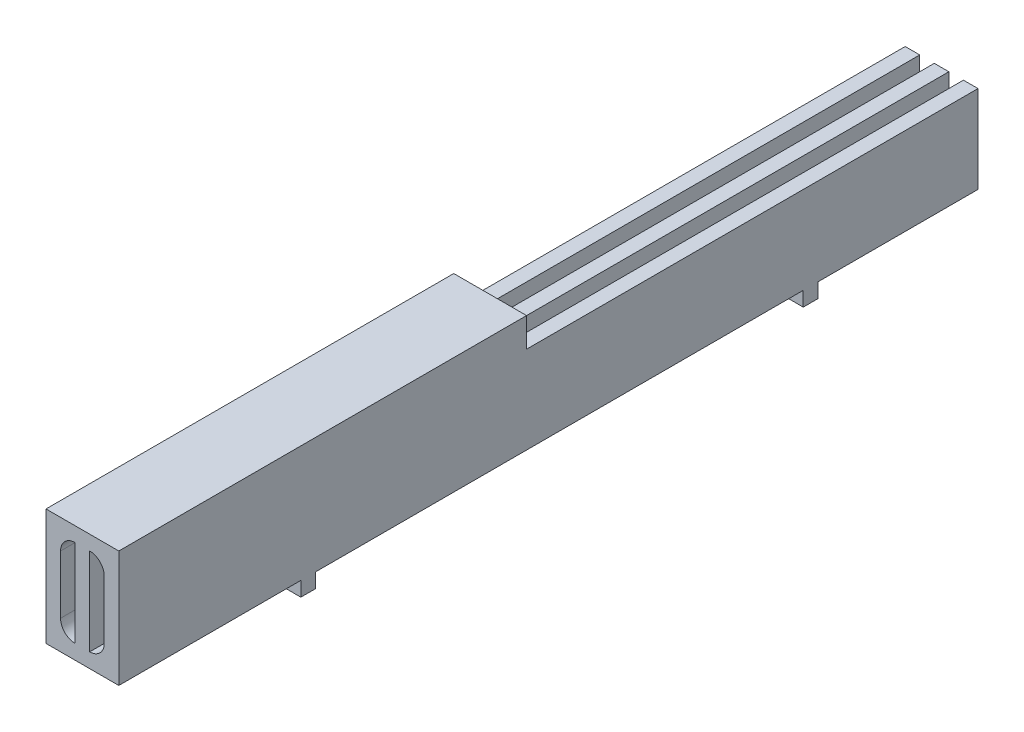
ISO-10303-21;
HEADER;
FILE_DESCRIPTION(('STEP AP214'),'2;1');
FILE_NAME('part.step','',(''),(''),'','','');
FILE_SCHEMA(('AUTOMOTIVE_DESIGN { 1 0 10303 214 1 1 1 1 }'));
ENDSEC;
DATA;
#1=APPLICATION_CONTEXT('core data for automotive mechanical design processes');
#2=APPLICATION_PROTOCOL_DEFINITION('international standard','automotive_design',2000,#1);
#3=PRODUCT_CONTEXT('',#1,'mechanical');
#4=PRODUCT('Part','Part','',(#3));
#5=PRODUCT_RELATED_PRODUCT_CATEGORY('part','',(#4));
#6=PRODUCT_DEFINITION_FORMATION('','',#4);
#7=PRODUCT_DEFINITION_CONTEXT('part definition',#1,'design');
#8=PRODUCT_DEFINITION('design','',#6,#7);
#9=PRODUCT_DEFINITION_SHAPE('','',#8);
#10=(LENGTH_UNIT() NAMED_UNIT(*) SI_UNIT(.MILLI.,.METRE.));
#11=(NAMED_UNIT(*) PLANE_ANGLE_UNIT() SI_UNIT($,.RADIAN.));
#12=(NAMED_UNIT(*) SI_UNIT($,.STERADIAN.) SOLID_ANGLE_UNIT());
#13=UNCERTAINTY_MEASURE_WITH_UNIT(LENGTH_MEASURE(1.E-05),#10,'distance_accuracy_value','');
#14=(GEOMETRIC_REPRESENTATION_CONTEXT(3) GLOBAL_UNCERTAINTY_ASSIGNED_CONTEXT((#13)) GLOBAL_UNIT_ASSIGNED_CONTEXT((#10,
#11,#12)) REPRESENTATION_CONTEXT('',''));
#15=CARTESIAN_POINT('',(0.,0.,0.));
#16=DIRECTION('',(0.,0.,1.));
#17=DIRECTION('',(1.,0.,0.));
#18=AXIS2_PLACEMENT_3D('',#15,#16,#17);
#19=CARTESIAN_POINT('',(0.,-4.,59.));
#20=DIRECTION('',(0.,1.,0.));
#21=DIRECTION('',(0.,0.,1.));
#22=AXIS2_PLACEMENT_3D('',#19,#20,#21);
#23=PLANE('',#22);
#24=DIRECTION('',(1.,0.,0.));
#25=VECTOR('',#24,1.);
#26=CARTESIAN_POINT('',(-2.5,-4.,45.5));
#27=LINE('',#26,#25);
#28=CARTESIAN_POINT('',(-2.5,-4.,45.5));
#29=VERTEX_POINT('',#28);
#30=CARTESIAN_POINT('',(2.5,-4.,45.5));
#31=VERTEX_POINT('',#30);
#32=EDGE_CURVE('E277',#29,#31,#27,.T.);
#33=ORIENTED_EDGE('',*,*,#32,.F.);
#34=DIRECTION('',(0.,0.,-1.));
#35=VECTOR('',#34,1.);
#36=CARTESIAN_POINT('',(-2.5,-4.,59.));
#37=LINE('',#36,#35);
#38=CARTESIAN_POINT('',(-2.5,-4.,12.));
#39=VERTEX_POINT('',#38);
#40=EDGE_CURVE('E435',#29,#39,#37,.T.);
#41=ORIENTED_EDGE('',*,*,#40,.T.);
#42=DIRECTION('',(-1.,0.,0.));
#43=VECTOR('',#42,1.);
#44=CARTESIAN_POINT('',(2.5,-4.,12.));
#45=LINE('',#44,#43);
#46=CARTESIAN_POINT('',(2.5,-4.,12.));
#47=VERTEX_POINT('',#46);
#48=EDGE_CURVE('E313',#47,#39,#45,.T.);
#49=ORIENTED_EDGE('',*,*,#48,.F.);
#50=DIRECTION('',(0.,0.,-1.));
#51=VECTOR('',#50,1.);
#52=CARTESIAN_POINT('',(2.5,-4.,59.));
#53=LINE('',#52,#51);
#54=EDGE_CURVE('E73',#31,#47,#53,.T.);
#55=ORIENTED_EDGE('',*,*,#54,.F.);
#56=EDGE_LOOP('',(#33,#41,#49,#55));
#57=FACE_BOUND('',#56,.T.);
#58=ADVANCED_FACE('F49',(#57),#23,.F.);
#59=DIRECTION('',(-1.,0.,0.));
#60=VECTOR('',#59,1.);
#61=CARTESIAN_POINT('',(-2.5,-4.,46.5));
#62=LINE('',#61,#60);
#63=CARTESIAN_POINT('',(2.5,-4.,46.5));
#64=VERTEX_POINT('',#63);
#65=CARTESIAN_POINT('',(-2.5,-4.,46.5));
#66=VERTEX_POINT('',#65);
#67=EDGE_CURVE('E283',#64,#66,#62,.T.);
#68=ORIENTED_EDGE('',*,*,#67,.F.);
#69=CARTESIAN_POINT('',(2.5,-4.,59.));
#70=VERTEX_POINT('',#69);
#71=EDGE_CURVE('E426',#70,#64,#53,.T.);
#72=ORIENTED_EDGE('',*,*,#71,.F.);
#73=DIRECTION('',(1.,0.,0.));
#74=VECTOR('',#73,1.);
#75=CARTESIAN_POINT('',(0.,-4.,59.));
#76=LINE('',#75,#74);
#77=CARTESIAN_POINT('',(-2.5,-4.,59.));
#78=VERTEX_POINT('',#77);
#79=EDGE_CURVE('E393',#78,#70,#76,.T.);
#80=ORIENTED_EDGE('',*,*,#79,.F.);
#81=EDGE_CURVE('E432',#78,#66,#37,.T.);
#82=ORIENTED_EDGE('',*,*,#81,.T.);
#83=EDGE_LOOP('',(#68,#72,#80,#82));
#84=FACE_BOUND('',#83,.T.);
#85=ADVANCED_FACE('F524',(#84),#23,.F.);
#86=DIRECTION('',(1.,0.,0.));
#87=VECTOR('',#86,1.);
#88=CARTESIAN_POINT('',(2.5,-4.,11.));
#89=LINE('',#88,#87);
#90=CARTESIAN_POINT('',(-2.5,-4.,11.));
#91=VERTEX_POINT('',#90);
#92=CARTESIAN_POINT('',(2.5,-4.,11.));
#93=VERTEX_POINT('',#92);
#94=EDGE_CURVE('E319',#91,#93,#89,.T.);
#95=ORIENTED_EDGE('',*,*,#94,.F.);
#96=CARTESIAN_POINT('',(-2.5,-4.,0.));
#97=VERTEX_POINT('',#96);
#98=EDGE_CURVE('E430',#91,#97,#37,.T.);
#99=ORIENTED_EDGE('',*,*,#98,.T.);
#100=DIRECTION('',(1.,0.,0.));
#101=VECTOR('',#100,1.);
#102=CARTESIAN_POINT('',(0.,-4.,0.));
#103=LINE('',#102,#101);
#104=CARTESIAN_POINT('',(2.5,-4.,0.));
#105=VERTEX_POINT('',#104);
#106=EDGE_CURVE('E355',#97,#105,#103,.T.);
#107=ORIENTED_EDGE('',*,*,#106,.T.);
#108=EDGE_CURVE('E431',#93,#105,#53,.T.);
#109=ORIENTED_EDGE('',*,*,#108,.F.);
#110=EDGE_LOOP('',(#95,#99,#107,#109));
#111=FACE_BOUND('',#110,.T.);
#112=ADVANCED_FACE('F556',(#111),#23,.F.);
#113=CARTESIAN_POINT('',(2.5,0.,59.));
#114=DIRECTION('',(1.,0.,0.));
#115=DIRECTION('',(0.,1.,0.));
#116=AXIS2_PLACEMENT_3D('',#113,#114,#115);
#117=PLANE('',#116);
#118=DIRECTION('',(0.,1.,0.));
#119=VECTOR('',#118,1.);
#120=CARTESIAN_POINT('',(2.5,2.,31.));
#121=LINE('',#120,#119);
#122=CARTESIAN_POINT('',(2.5,2.,31.));
#123=VERTEX_POINT('',#122);
#124=CARTESIAN_POINT('',(2.5,4.,31.));
#125=VERTEX_POINT('',#124);
#126=EDGE_CURVE('E243',#123,#125,#121,.T.);
#127=ORIENTED_EDGE('',*,*,#126,.T.);
#128=DIRECTION('',(0.,0.,-1.));
#129=VECTOR('',#128,1.);
#130=CARTESIAN_POINT('',(2.5,4.,59.));
#131=LINE('',#130,#129);
#132=CARTESIAN_POINT('',(2.5,4.,59.));
#133=VERTEX_POINT('',#132);
#134=EDGE_CURVE('E438',#133,#125,#131,.T.);
#135=ORIENTED_EDGE('',*,*,#134,.F.);
#136=DIRECTION('',(0.,-1.,0.));
#137=VECTOR('',#136,1.);
#138=CARTESIAN_POINT('',(2.5,0.,59.));
#139=LINE('',#138,#137);
#140=EDGE_CURVE('E381',#133,#70,#139,.T.);
#141=ORIENTED_EDGE('',*,*,#140,.T.);
#142=ORIENTED_EDGE('',*,*,#71,.T.);
#143=DIRECTION('',(0.,1.,0.));
#144=VECTOR('',#143,1.);
#145=CARTESIAN_POINT('',(2.5,-5.,46.5));
#146=LINE('',#145,#144);
#147=CARTESIAN_POINT('',(2.5,-5.,46.5));
#148=VERTEX_POINT('',#147);
#149=EDGE_CURVE('E301',#148,#64,#146,.T.);
#150=ORIENTED_EDGE('',*,*,#149,.F.);
#151=DIRECTION('',(0.,0.,1.));
#152=VECTOR('',#151,1.);
#153=CARTESIAN_POINT('',(2.5,-5.,45.5));
#154=LINE('',#153,#152);
#155=CARTESIAN_POINT('',(2.5,-5.,45.5));
#156=VERTEX_POINT('',#155);
#157=EDGE_CURVE('E286',#156,#148,#154,.T.);
#158=ORIENTED_EDGE('',*,*,#157,.F.);
#159=DIRECTION('',(0.,1.,0.));
#160=VECTOR('',#159,1.);
#161=CARTESIAN_POINT('',(2.5,-5.,45.5));
#162=LINE('',#161,#160);
#163=EDGE_CURVE('E305',#156,#31,#162,.T.);
#164=ORIENTED_EDGE('',*,*,#163,.T.);
#165=ORIENTED_EDGE('',*,*,#54,.T.);
#166=DIRECTION('',(0.,1.,0.));
#167=VECTOR('',#166,1.);
#168=CARTESIAN_POINT('',(2.5,-5.,12.));
#169=LINE('',#168,#167);
#170=CARTESIAN_POINT('',(2.5,-5.,12.));
#171=VERTEX_POINT('',#170);
#172=EDGE_CURVE('E346',#171,#47,#169,.T.);
#173=ORIENTED_EDGE('',*,*,#172,.F.);
#174=DIRECTION('',(0.,0.,1.));
#175=VECTOR('',#174,1.);
#176=CARTESIAN_POINT('',(2.5,-5.,12.));
#177=LINE('',#176,#175);
#178=CARTESIAN_POINT('',(2.5,-5.,11.));
#179=VERTEX_POINT('',#178);
#180=EDGE_CURVE('E314',#179,#171,#177,.T.);
#181=ORIENTED_EDGE('',*,*,#180,.F.);
#182=DIRECTION('',(0.,1.,0.));
#183=VECTOR('',#182,1.);
#184=CARTESIAN_POINT('',(2.5,-5.,11.));
#185=LINE('',#184,#183);
#186=EDGE_CURVE('E328',#179,#93,#185,.T.);
#187=ORIENTED_EDGE('',*,*,#186,.T.);
#188=ORIENTED_EDGE('',*,*,#108,.T.);
#189=DIRECTION('',(0.,-1.,0.));
#190=VECTOR('',#189,1.);
#191=CARTESIAN_POINT('',(2.5,0.,0.));
#192=LINE('',#191,#190);
#193=CARTESIAN_POINT('',(2.5,2.,0.));
#194=VERTEX_POINT('',#193);
#195=EDGE_CURVE('E417',#194,#105,#192,.T.);
#196=ORIENTED_EDGE('',*,*,#195,.F.);
#197=DIRECTION('',(0.,0.,-1.));
#198=VECTOR('',#197,1.);
#199=CARTESIAN_POINT('',(2.5,2.,31.));
#200=LINE('',#199,#198);
#201=EDGE_CURVE('E65',#123,#194,#200,.T.);
#202=ORIENTED_EDGE('',*,*,#201,.F.);
#203=EDGE_LOOP('',(#127,#135,#141,#142,#150,#158,#164,#165,#173,#181,#187,#188,#196,#202));
#204=FACE_BOUND('',#203,.T.);
#205=ADVANCED_FACE('F530',(#204),#117,.T.);
#206=CARTESIAN_POINT('',(0.,4.,59.));
#207=DIRECTION('',(0.,1.,0.));
#208=DIRECTION('',(0.,0.,1.));
#209=AXIS2_PLACEMENT_3D('',#206,#207,#208);
#210=PLANE('',#209);
#211=DIRECTION('',(1.,0.,0.));
#212=VECTOR('',#211,1.);
#213=CARTESIAN_POINT('',(-2.5,4.,31.));
#214=LINE('',#213,#212);
#215=CARTESIAN_POINT('',(-2.5,4.,31.));
#216=VERTEX_POINT('',#215);
#217=EDGE_CURVE('E236',#216,#125,#214,.T.);
#218=ORIENTED_EDGE('',*,*,#217,.F.);
#219=DIRECTION('',(0.,0.,-1.));
#220=VECTOR('',#219,1.);
#221=CARTESIAN_POINT('',(-2.5,4.,59.));
#222=LINE('',#221,#220);
#223=CARTESIAN_POINT('',(-2.5,4.,59.));
#224=VERTEX_POINT('',#223);
#225=EDGE_CURVE('E241',#224,#216,#222,.T.);
#226=ORIENTED_EDGE('',*,*,#225,.F.);
#227=DIRECTION('',(1.,0.,0.));
#228=VECTOR('',#227,1.);
#229=CARTESIAN_POINT('',(0.,4.,59.));
#230=LINE('',#229,#228);
#231=EDGE_CURVE('E385',#224,#133,#230,.T.);
#232=ORIENTED_EDGE('',*,*,#231,.T.);
#233=ORIENTED_EDGE('',*,*,#134,.T.);
#234=EDGE_LOOP('',(#218,#226,#232,#233));
#235=FACE_BOUND('',#234,.T.);
#236=ADVANCED_FACE('F519',(#235),#210,.T.);
#237=CARTESIAN_POINT('',(-2.5,0.,59.));
#238=DIRECTION('',(1.,0.,0.));
#239=DIRECTION('',(0.,1.,0.));
#240=AXIS2_PLACEMENT_3D('',#237,#238,#239);
#241=PLANE('',#240);
#242=ORIENTED_EDGE('',*,*,#225,.T.);
#243=DIRECTION('',(0.,1.,0.));
#244=VECTOR('',#243,1.);
#245=CARTESIAN_POINT('',(-2.5,2.,31.));
#246=LINE('',#245,#244);
#247=CARTESIAN_POINT('',(-2.5,2.,31.));
#248=VERTEX_POINT('',#247);
#249=EDGE_CURVE('E220',#248,#216,#246,.T.);
#250=ORIENTED_EDGE('',*,*,#249,.F.);
#251=DIRECTION('',(0.,0.,1.));
#252=VECTOR('',#251,1.);
#253=CARTESIAN_POINT('',(-2.5,2.,31.));
#254=LINE('',#253,#252);
#255=CARTESIAN_POINT('',(-2.5,2.,0.));
#256=VERTEX_POINT('',#255);
#257=EDGE_CURVE('E230',#256,#248,#254,.T.);
#258=ORIENTED_EDGE('',*,*,#257,.F.);
#259=DIRECTION('',(0.,-1.,0.));
#260=VECTOR('',#259,1.);
#261=CARTESIAN_POINT('',(-2.5,0.,0.));
#262=LINE('',#261,#260);
#263=EDGE_CURVE('E420',#256,#97,#262,.T.);
#264=ORIENTED_EDGE('',*,*,#263,.T.);
#265=ORIENTED_EDGE('',*,*,#98,.F.);
#266=DIRECTION('',(0.,1.,0.));
#267=VECTOR('',#266,1.);
#268=CARTESIAN_POINT('',(-2.5,-5.,11.));
#269=LINE('',#268,#267);
#270=CARTESIAN_POINT('',(-2.5,-5.,11.));
#271=VERTEX_POINT('',#270);
#272=EDGE_CURVE('E338',#271,#91,#269,.T.);
#273=ORIENTED_EDGE('',*,*,#272,.F.);
#274=DIRECTION('',(0.,0.,-1.));
#275=VECTOR('',#274,1.);
#276=CARTESIAN_POINT('',(-2.5,-5.,11.));
#277=LINE('',#276,#275);
#278=CARTESIAN_POINT('',(-2.5,-5.,12.));
#279=VERTEX_POINT('',#278);
#280=EDGE_CURVE('E322',#279,#271,#277,.T.);
#281=ORIENTED_EDGE('',*,*,#280,.F.);
#282=DIRECTION('',(0.,1.,0.));
#283=VECTOR('',#282,1.);
#284=CARTESIAN_POINT('',(-2.5,-5.,12.));
#285=LINE('',#284,#283);
#286=EDGE_CURVE('E342',#279,#39,#285,.T.);
#287=ORIENTED_EDGE('',*,*,#286,.T.);
#288=ORIENTED_EDGE('',*,*,#40,.F.);
#289=DIRECTION('',(0.,1.,0.));
#290=VECTOR('',#289,1.);
#291=CARTESIAN_POINT('',(-2.5,-5.,45.5));
#292=LINE('',#291,#290);
#293=CARTESIAN_POINT('',(-2.5,-5.,45.5));
#294=VERTEX_POINT('',#293);
#295=EDGE_CURVE('E309',#294,#29,#292,.T.);
#296=ORIENTED_EDGE('',*,*,#295,.F.);
#297=DIRECTION('',(0.,0.,-1.));
#298=VECTOR('',#297,1.);
#299=CARTESIAN_POINT('',(-2.5,-5.,46.5));
#300=LINE('',#299,#298);
#301=CARTESIAN_POINT('',(-2.5,-5.,46.5));
#302=VERTEX_POINT('',#301);
#303=EDGE_CURVE('E278',#302,#294,#300,.T.);
#304=ORIENTED_EDGE('',*,*,#303,.F.);
#305=DIRECTION('',(0.,1.,0.));
#306=VECTOR('',#305,1.);
#307=CARTESIAN_POINT('',(-2.5,-5.,46.5));
#308=LINE('',#307,#306);
#309=EDGE_CURVE('E292',#302,#66,#308,.T.);
#310=ORIENTED_EDGE('',*,*,#309,.T.);
#311=ORIENTED_EDGE('',*,*,#81,.F.);
#312=DIRECTION('',(0.,-1.,0.));
#313=VECTOR('',#312,1.);
#314=CARTESIAN_POINT('',(-2.5,0.,59.));
#315=LINE('',#314,#313);
#316=EDGE_CURVE('E389',#224,#78,#315,.T.);
#317=ORIENTED_EDGE('',*,*,#316,.F.);
#318=EDGE_LOOP('',(#242,#250,#258,#264,#265,#273,#281,#287,#288,#296,#304,#310,#311,#317));
#319=FACE_BOUND('',#318,.T.);
#320=ADVANCED_FACE('F239',(#319),#241,.F.);
#321=CARTESIAN_POINT('',(-0.500000000000001,0.,59.));
#322=DIRECTION('',(1.,0.,0.));
#323=DIRECTION('',(0.,0.,-1.));
#324=AXIS2_PLACEMENT_3D('',#321,#322,#323);
#325=PLANE('',#324);
#326=DIRECTION('',(0.,0.,-1.));
#327=VECTOR('',#326,1.);
#328=CARTESIAN_POINT('',(-0.499999999999993,3.,59.));
#329=LINE('',#328,#327);
#330=CARTESIAN_POINT('',(-0.499999999999993,3.,59.));
#331=VERTEX_POINT('',#330);
#332=CARTESIAN_POINT('',(-0.499999999999993,3.,31.));
#333=VERTEX_POINT('',#332);
#334=EDGE_CURVE('E443',#331,#333,#329,.T.);
#335=ORIENTED_EDGE('',*,*,#334,.T.);
#336=DIRECTION('',(0.,-1.,0.));
#337=VECTOR('',#336,1.);
#338=CARTESIAN_POINT('',(-0.500000000000001,0.,31.));
#339=LINE('',#338,#337);
#340=CARTESIAN_POINT('',(-0.5,2.,31.));
#341=VERTEX_POINT('',#340);
#342=EDGE_CURVE('E267',#333,#341,#339,.T.);
#343=ORIENTED_EDGE('',*,*,#342,.T.);
#344=DIRECTION('',(0.,0.,-1.));
#345=VECTOR('',#344,1.);
#346=CARTESIAN_POINT('',(-0.500000000000001,2.,59.));
#347=LINE('',#346,#345);
#348=CARTESIAN_POINT('',(-0.499999999999993,2.,0.));
#349=VERTEX_POINT('',#348);
#350=EDGE_CURVE('E263',#341,#349,#347,.T.);
#351=ORIENTED_EDGE('',*,*,#350,.T.);
#352=DIRECTION('',(0.,-1.,0.));
#353=VECTOR('',#352,1.);
#354=CARTESIAN_POINT('',(-0.500000000000001,0.,0.));
#355=LINE('',#354,#353);
#356=CARTESIAN_POINT('',(-0.499999999999993,-3.,0.));
#357=VERTEX_POINT('',#356);
#358=EDGE_CURVE('E406',#349,#357,#355,.T.);
#359=ORIENTED_EDGE('',*,*,#358,.T.);
#360=DIRECTION('',(0.,0.,-1.));
#361=VECTOR('',#360,1.);
#362=CARTESIAN_POINT('',(-0.499999999999993,-3.,59.));
#363=LINE('',#362,#361);
#364=CARTESIAN_POINT('',(-0.499999999999993,-3.,59.));
#365=VERTEX_POINT('',#364);
#366=EDGE_CURVE('E455',#365,#357,#363,.T.);
#367=ORIENTED_EDGE('',*,*,#366,.F.);
#368=DIRECTION('',(0.,-1.,0.));
#369=VECTOR('',#368,1.);
#370=CARTESIAN_POINT('',(-0.500000000000001,0.,59.));
#371=LINE('',#370,#369);
#372=EDGE_CURVE('E366',#331,#365,#371,.T.);
#373=ORIENTED_EDGE('',*,*,#372,.F.);
#374=EDGE_LOOP('',(#335,#343,#351,#359,#367,#373));
#375=FACE_BOUND('',#374,.T.);
#376=ADVANCED_FACE('F597',(#375),#325,.F.);
#377=CARTESIAN_POINT('',(-0.5,-2.,59.));
#378=DIRECTION('',(0.,0.,-1.));
#379=DIRECTION('',(-1.,0.,0.));
#380=AXIS2_PLACEMENT_3D('',#377,#378,#379);
#381=CYLINDRICAL_SURFACE('',#380,1.);
#382=CARTESIAN_POINT('',(-0.5,-2.,0.));
#383=DIRECTION('',(0.,0.,1.));
#384=DIRECTION('',(1.,0.,0.));
#385=AXIS2_PLACEMENT_3D('',#382,#383,#384);
#386=CIRCLE('',#385,1.);
#387=CARTESIAN_POINT('',(-1.5,-1.99999999999999,0.));
#388=VERTEX_POINT('',#387);
#389=EDGE_CURVE('E409',#357,#388,#386,.F.);
#390=ORIENTED_EDGE('',*,*,#389,.T.);
#391=DIRECTION('',(0.,0.,-1.));
#392=VECTOR('',#391,1.);
#393=CARTESIAN_POINT('',(-1.5,-1.99999999999999,59.));
#394=LINE('',#393,#392);
#395=CARTESIAN_POINT('',(-1.5,-1.99999999999999,59.));
#396=VERTEX_POINT('',#395);
#397=EDGE_CURVE('E452',#396,#388,#394,.T.);
#398=ORIENTED_EDGE('',*,*,#397,.F.);
#399=CARTESIAN_POINT('',(-0.5,-2.,59.));
#400=DIRECTION('',(0.,0.,1.));
#401=DIRECTION('',(1.,0.,0.));
#402=AXIS2_PLACEMENT_3D('',#399,#400,#401);
#403=CIRCLE('',#402,1.);
#404=EDGE_CURVE('E370',#365,#396,#403,.F.);
#405=ORIENTED_EDGE('',*,*,#404,.F.);
#406=ORIENTED_EDGE('',*,*,#366,.T.);
#407=EDGE_LOOP('',(#390,#398,#405,#406));
#408=FACE_BOUND('',#407,.T.);
#409=ADVANCED_FACE('F593',(#408),#381,.F.);
#410=CARTESIAN_POINT('',(-1.5,0.,59.));
#411=DIRECTION('',(1.,0.,0.));
#412=DIRECTION('',(0.,0.,-1.));
#413=AXIS2_PLACEMENT_3D('',#410,#411,#412);
#414=PLANE('',#413);
#415=DIRECTION('',(0.,-1.,0.));
#416=VECTOR('',#415,1.);
#417=CARTESIAN_POINT('',(-1.5,0.,0.));
#418=LINE('',#417,#416);
#419=CARTESIAN_POINT('',(-1.5,2.,0.));
#420=VERTEX_POINT('',#419);
#421=EDGE_CURVE('E413',#420,#388,#418,.T.);
#422=ORIENTED_EDGE('',*,*,#421,.F.);
#423=DIRECTION('',(0.,0.,-1.));
#424=VECTOR('',#423,1.);
#425=CARTESIAN_POINT('',(-1.5,2.,59.));
#426=LINE('',#425,#424);
#427=CARTESIAN_POINT('',(-1.5,2.,31.));
#428=VERTEX_POINT('',#427);
#429=EDGE_CURVE('E257',#428,#420,#426,.T.);
#430=ORIENTED_EDGE('',*,*,#429,.F.);
#431=DIRECTION('',(0.,0.,-1.));
#432=VECTOR('',#431,1.);
#433=CARTESIAN_POINT('',(-1.5,1.99999999999999,59.));
#434=LINE('',#433,#432);
#435=CARTESIAN_POINT('',(-1.5,1.99999999999999,59.));
#436=VERTEX_POINT('',#435);
#437=EDGE_CURVE('E447',#436,#428,#434,.T.);
#438=ORIENTED_EDGE('',*,*,#437,.F.);
#439=DIRECTION('',(0.,-1.,0.));
#440=VECTOR('',#439,1.);
#441=CARTESIAN_POINT('',(-1.5,0.,59.));
#442=LINE('',#441,#440);
#443=EDGE_CURVE('E373',#436,#396,#442,.T.);
#444=ORIENTED_EDGE('',*,*,#443,.T.);
#445=ORIENTED_EDGE('',*,*,#397,.T.);
#446=EDGE_LOOP('',(#422,#430,#438,#444,#445));
#447=FACE_BOUND('',#446,.T.);
#448=ADVANCED_FACE('F590',(#447),#414,.T.);
#449=CARTESIAN_POINT('',(0.5,-2.,59.));
#450=DIRECTION('',(0.,0.,-1.));
#451=DIRECTION('',(-1.,0.,0.));
#452=AXIS2_PLACEMENT_3D('',#449,#450,#451);
#453=CYLINDRICAL_SURFACE('',#452,1.);
#454=CARTESIAN_POINT('',(0.5,-2.,0.));
#455=DIRECTION('',(0.,0.,1.));
#456=DIRECTION('',(1.,0.,0.));
#457=AXIS2_PLACEMENT_3D('',#454,#455,#456);
#458=CIRCLE('',#457,1.);
#459=CARTESIAN_POINT('',(1.5,-1.99999999999999,0.));
#460=VERTEX_POINT('',#459);
#461=CARTESIAN_POINT('',(0.499999999999993,-3.,0.));
#462=VERTEX_POINT('',#461);
#463=EDGE_CURVE('E350',#460,#462,#458,.F.);
#464=ORIENTED_EDGE('',*,*,#463,.T.);
#465=DIRECTION('',(0.,0.,-1.));
#466=VECTOR('',#465,1.);
#467=CARTESIAN_POINT('',(0.499999999999993,-3.,59.));
#468=LINE('',#467,#466);
#469=CARTESIAN_POINT('',(0.499999999999993,-3.,59.));
#470=VERTEX_POINT('',#469);
#471=EDGE_CURVE('E448',#470,#462,#468,.T.);
#472=ORIENTED_EDGE('',*,*,#471,.F.);
#473=CARTESIAN_POINT('',(0.5,-2.,59.));
#474=DIRECTION('',(0.,0.,1.));
#475=DIRECTION('',(1.,0.,0.));
#476=AXIS2_PLACEMENT_3D('',#473,#474,#475);
#477=CIRCLE('',#476,1.);
#478=CARTESIAN_POINT('',(1.5,-1.99999999999999,59.));
#479=VERTEX_POINT('',#478);
#480=EDGE_CURVE('E351',#479,#470,#477,.F.);
#481=ORIENTED_EDGE('',*,*,#480,.F.);
#482=DIRECTION('',(0.,0.,-1.));
#483=VECTOR('',#482,1.);
#484=CARTESIAN_POINT('',(1.5,-1.99999999999999,59.));
#485=LINE('',#484,#483);
#486=EDGE_CURVE('E396',#479,#460,#485,.T.);
#487=ORIENTED_EDGE('',*,*,#486,.T.);
#488=EDGE_LOOP('',(#464,#472,#481,#487));
#489=FACE_BOUND('',#488,.T.);
#490=ADVANCED_FACE('F51',(#489),#453,.F.);
#491=CARTESIAN_POINT('',(0.499999999999999,0.,59.));
#492=DIRECTION('',(1.,0.,0.));
#493=DIRECTION('',(0.,0.,-1.));
#494=AXIS2_PLACEMENT_3D('',#491,#492,#493);
#495=PLANE('',#494);
#496=DIRECTION('',(0.,-1.,0.));
#497=VECTOR('',#496,1.);
#498=CARTESIAN_POINT('',(0.499999999999999,0.,31.));
#499=LINE('',#498,#497);
#500=CARTESIAN_POINT('',(0.499999999999993,3.,31.));
#501=VERTEX_POINT('',#500);
#502=CARTESIAN_POINT('',(0.5,2.,31.));
#503=VERTEX_POINT('',#502);
#504=EDGE_CURVE('E274',#501,#503,#499,.T.);
#505=ORIENTED_EDGE('',*,*,#504,.F.);
#506=DIRECTION('',(0.,0.,-1.));
#507=VECTOR('',#506,1.);
#508=CARTESIAN_POINT('',(0.499999999999993,3.,59.));
#509=LINE('',#508,#507);
#510=CARTESIAN_POINT('',(0.499999999999993,3.,59.));
#511=VERTEX_POINT('',#510);
#512=EDGE_CURVE('E466',#511,#501,#509,.T.);
#513=ORIENTED_EDGE('',*,*,#512,.F.);
#514=DIRECTION('',(0.,-1.,0.));
#515=VECTOR('',#514,1.);
#516=CARTESIAN_POINT('',(0.499999999999999,0.,59.));
#517=LINE('',#516,#515);
#518=EDGE_CURVE('E354',#511,#470,#517,.T.);
#519=ORIENTED_EDGE('',*,*,#518,.T.);
#520=ORIENTED_EDGE('',*,*,#471,.T.);
#521=DIRECTION('',(0.,-1.,0.));
#522=VECTOR('',#521,1.);
#523=CARTESIAN_POINT('',(0.499999999999999,0.,0.));
#524=LINE('',#523,#522);
#525=CARTESIAN_POINT('',(0.499999999999993,2.,0.));
#526=VERTEX_POINT('',#525);
#527=EDGE_CURVE('E400',#526,#462,#524,.T.);
#528=ORIENTED_EDGE('',*,*,#527,.F.);
#529=DIRECTION('',(0.,0.,-1.));
#530=VECTOR('',#529,1.);
#531=CARTESIAN_POINT('',(0.499999999999999,2.,59.));
#532=LINE('',#531,#530);
#533=EDGE_CURVE('E260',#503,#526,#532,.T.);
#534=ORIENTED_EDGE('',*,*,#533,.F.);
#535=EDGE_LOOP('',(#505,#513,#519,#520,#528,#534));
#536=FACE_BOUND('',#535,.T.);
#537=ADVANCED_FACE('F486',(#536),#495,.T.);
#538=CARTESIAN_POINT('',(0.5,2.,59.));
#539=DIRECTION('',(0.,0.,-1.));
#540=DIRECTION('',(-1.,0.,0.));
#541=AXIS2_PLACEMENT_3D('',#538,#539,#540);
#542=CYLINDRICAL_SURFACE('',#541,1.);
#543=CARTESIAN_POINT('',(0.5,2.,31.));
#544=DIRECTION('',(0.,0.,1.));
#545=DIRECTION('',(1.,0.,0.));
#546=AXIS2_PLACEMENT_3D('',#543,#544,#545);
#547=CIRCLE('',#546,1.);
#548=CARTESIAN_POINT('',(1.5,2.,31.));
#549=VERTEX_POINT('',#548);
#550=EDGE_CURVE('E271',#549,#501,#547,.T.);
#551=ORIENTED_EDGE('',*,*,#550,.F.);
#552=DIRECTION('',(0.,0.,-1.));
#553=VECTOR('',#552,1.);
#554=CARTESIAN_POINT('',(1.5,1.99999999999999,59.));
#555=LINE('',#554,#553);
#556=CARTESIAN_POINT('',(1.5,1.99999999999999,59.));
#557=VERTEX_POINT('',#556);
#558=EDGE_CURVE('E462',#557,#549,#555,.T.);
#559=ORIENTED_EDGE('',*,*,#558,.F.);
#560=CARTESIAN_POINT('',(0.5,2.,59.));
#561=DIRECTION('',(0.,0.,1.));
#562=DIRECTION('',(1.,0.,0.));
#563=AXIS2_PLACEMENT_3D('',#560,#561,#562);
#564=CIRCLE('',#563,1.);
#565=EDGE_CURVE('E359',#557,#511,#564,.T.);
#566=ORIENTED_EDGE('',*,*,#565,.T.);
#567=ORIENTED_EDGE('',*,*,#512,.T.);
#568=EDGE_LOOP('',(#551,#559,#566,#567));
#569=FACE_BOUND('',#568,.T.);
#570=ADVANCED_FACE('F503',(#569),#542,.F.);
#571=CARTESIAN_POINT('',(-0.5,2.,59.));
#572=DIRECTION('',(0.,0.,-1.));
#573=DIRECTION('',(-1.,0.,0.));
#574=AXIS2_PLACEMENT_3D('',#571,#572,#573);
#575=CYLINDRICAL_SURFACE('',#574,1.);
#576=CARTESIAN_POINT('',(-0.5,2.,31.));
#577=DIRECTION('',(0.,0.,1.));
#578=DIRECTION('',(1.,0.,0.));
#579=AXIS2_PLACEMENT_3D('',#576,#577,#578);
#580=CIRCLE('',#579,1.);
#581=EDGE_CURVE('E11',#333,#428,#580,.T.);
#582=ORIENTED_EDGE('',*,*,#581,.F.);
#583=ORIENTED_EDGE('',*,*,#334,.F.);
#584=CARTESIAN_POINT('',(-0.5,2.,59.));
#585=DIRECTION('',(0.,0.,1.));
#586=DIRECTION('',(1.,0.,0.));
#587=AXIS2_PLACEMENT_3D('',#584,#585,#586);
#588=CIRCLE('',#587,1.);
#589=EDGE_CURVE('E377',#331,#436,#588,.T.);
#590=ORIENTED_EDGE('',*,*,#589,.T.);
#591=ORIENTED_EDGE('',*,*,#437,.T.);
#592=EDGE_LOOP('',(#582,#583,#590,#591));
#593=FACE_BOUND('',#592,.T.);
#594=ADVANCED_FACE('F586',(#593),#575,.F.);
#595=CARTESIAN_POINT('',(1.5,0.,59.));
#596=DIRECTION('',(1.,0.,0.));
#597=DIRECTION('',(0.,0.,-1.));
#598=AXIS2_PLACEMENT_3D('',#595,#596,#597);
#599=PLANE('',#598);
#600=DIRECTION('',(0.,-1.,0.));
#601=VECTOR('',#600,1.);
#602=CARTESIAN_POINT('',(1.5,0.,0.));
#603=LINE('',#602,#601);
#604=CARTESIAN_POINT('',(1.5,2.,0.));
#605=VERTEX_POINT('',#604);
#606=EDGE_CURVE('E403',#605,#460,#603,.T.);
#607=ORIENTED_EDGE('',*,*,#606,.T.);
#608=ORIENTED_EDGE('',*,*,#486,.F.);
#609=DIRECTION('',(0.,-1.,0.));
#610=VECTOR('',#609,1.);
#611=CARTESIAN_POINT('',(1.5,0.,59.));
#612=LINE('',#611,#610);
#613=EDGE_CURVE('E363',#557,#479,#612,.T.);
#614=ORIENTED_EDGE('',*,*,#613,.F.);
#615=ORIENTED_EDGE('',*,*,#558,.T.);
#616=DIRECTION('',(0.,0.,-1.));
#617=VECTOR('',#616,1.);
#618=CARTESIAN_POINT('',(1.5,2.,59.));
#619=LINE('',#618,#617);
#620=EDGE_CURVE('E249',#549,#605,#619,.T.);
#621=ORIENTED_EDGE('',*,*,#620,.T.);
#622=EDGE_LOOP('',(#607,#608,#614,#615,#621));
#623=FACE_BOUND('',#622,.T.);
#624=ADVANCED_FACE('F495',(#623),#599,.F.);
#625=CARTESIAN_POINT('',(0.,0.,59.));
#626=DIRECTION('',(0.,0.,1.));
#627=DIRECTION('',(1.,0.,0.));
#628=AXIS2_PLACEMENT_3D('',#625,#626,#627);
#629=PLANE('',#628);
#630=ORIENTED_EDGE('',*,*,#480,.T.);
#631=ORIENTED_EDGE('',*,*,#518,.F.);
#632=ORIENTED_EDGE('',*,*,#565,.F.);
#633=ORIENTED_EDGE('',*,*,#613,.T.);
#634=EDGE_LOOP('',(#630,#631,#632,#633));
#635=FACE_BOUND('',#634,.T.);
#636=ORIENTED_EDGE('',*,*,#372,.T.);
#637=ORIENTED_EDGE('',*,*,#404,.T.);
#638=ORIENTED_EDGE('',*,*,#443,.F.);
#639=ORIENTED_EDGE('',*,*,#589,.F.);
#640=EDGE_LOOP('',(#636,#637,#638,#639));
#641=FACE_BOUND('',#640,.T.);
#642=ORIENTED_EDGE('',*,*,#140,.F.);
#643=ORIENTED_EDGE('',*,*,#231,.F.);
#644=ORIENTED_EDGE('',*,*,#316,.T.);
#645=ORIENTED_EDGE('',*,*,#79,.T.);
#646=EDGE_LOOP('',(#642,#643,#644,#645));
#647=FACE_BOUND('',#646,.T.);
#648=ADVANCED_FACE('F506',(#635,#641,#647),#629,.T.);
#649=CARTESIAN_POINT('',(0.,0.,0.));
#650=DIRECTION('',(0.,0.,1.));
#651=DIRECTION('',(1.,0.,0.));
#652=AXIS2_PLACEMENT_3D('',#649,#650,#651);
#653=PLANE('',#652);
#654=ORIENTED_EDGE('',*,*,#263,.F.);
#655=DIRECTION('',(1.,0.,0.));
#656=VECTOR('',#655,1.);
#657=CARTESIAN_POINT('',(0.,2.,0.));
#658=LINE('',#657,#656);
#659=EDGE_CURVE('E58',#256,#420,#658,.T.);
#660=ORIENTED_EDGE('',*,*,#659,.T.);
#661=ORIENTED_EDGE('',*,*,#421,.T.);
#662=ORIENTED_EDGE('',*,*,#389,.F.);
#663=ORIENTED_EDGE('',*,*,#358,.F.);
#664=EDGE_CURVE('E442',#349,#526,#658,.T.);
#665=ORIENTED_EDGE('',*,*,#664,.T.);
#666=ORIENTED_EDGE('',*,*,#527,.T.);
#667=ORIENTED_EDGE('',*,*,#463,.F.);
#668=ORIENTED_EDGE('',*,*,#606,.F.);
#669=DIRECTION('',(-1.,0.,0.));
#670=VECTOR('',#669,1.);
#671=CARTESIAN_POINT('',(-2.5,2.,0.));
#672=LINE('',#671,#670);
#673=EDGE_CURVE('E244',#194,#605,#672,.T.);
#674=ORIENTED_EDGE('',*,*,#673,.F.);
#675=ORIENTED_EDGE('',*,*,#195,.T.);
#676=ORIENTED_EDGE('',*,*,#106,.F.);
#677=EDGE_LOOP('',(#654,#660,#661,#662,#663,#665,#666,#667,#668,#674,#675,#676));
#678=FACE_BOUND('',#677,.T.);
#679=ADVANCED_FACE('F479',(#678),#653,.F.);
#680=CARTESIAN_POINT('',(2.5,-5.,12.));
#681=DIRECTION('',(0.,0.,-1.));
#682=DIRECTION('',(-1.,0.,0.));
#683=AXIS2_PLACEMENT_3D('',#680,#681,#682);
#684=PLANE('',#683);
#685=ORIENTED_EDGE('',*,*,#48,.T.);
#686=ORIENTED_EDGE('',*,*,#286,.F.);
#687=DIRECTION('',(-1.,0.,0.));
#688=VECTOR('',#687,1.);
#689=CARTESIAN_POINT('',(2.5,-5.,12.));
#690=LINE('',#689,#688);
#691=EDGE_CURVE('E318',#171,#279,#690,.T.);
#692=ORIENTED_EDGE('',*,*,#691,.F.);
#693=ORIENTED_EDGE('',*,*,#172,.T.);
#694=EDGE_LOOP('',(#685,#686,#692,#693));
#695=FACE_BOUND('',#694,.T.);
#696=ADVANCED_FACE('F540',(#695),#684,.F.);
#697=CARTESIAN_POINT('',(2.5,-5.,11.));
#698=DIRECTION('',(0.,0.,1.));
#699=DIRECTION('',(1.,0.,0.));
#700=AXIS2_PLACEMENT_3D('',#697,#698,#699);
#701=PLANE('',#700);
#702=ORIENTED_EDGE('',*,*,#94,.T.);
#703=ORIENTED_EDGE('',*,*,#186,.F.);
#704=DIRECTION('',(1.,0.,0.));
#705=VECTOR('',#704,1.);
#706=CARTESIAN_POINT('',(2.5,-5.,11.));
#707=LINE('',#706,#705);
#708=EDGE_CURVE('E325',#271,#179,#707,.T.);
#709=ORIENTED_EDGE('',*,*,#708,.F.);
#710=ORIENTED_EDGE('',*,*,#272,.T.);
#711=EDGE_LOOP('',(#702,#703,#709,#710));
#712=FACE_BOUND('',#711,.T.);
#713=ADVANCED_FACE('F559',(#712),#701,.F.);
#714=CARTESIAN_POINT('',(0.,-5.,0.));
#715=DIRECTION('',(0.,1.,0.));
#716=DIRECTION('',(0.,0.,1.));
#717=AXIS2_PLACEMENT_3D('',#714,#715,#716);
#718=PLANE('',#717);
#719=ORIENTED_EDGE('',*,*,#180,.T.);
#720=ORIENTED_EDGE('',*,*,#691,.T.);
#721=ORIENTED_EDGE('',*,*,#280,.T.);
#722=ORIENTED_EDGE('',*,*,#708,.T.);
#723=EDGE_LOOP('',(#719,#720,#721,#722));
#724=FACE_BOUND('',#723,.T.);
#725=ADVANCED_FACE('F547',(#724),#718,.F.);
#726=CARTESIAN_POINT('',(-2.5,-5.,45.5));
#727=DIRECTION('',(0.,0.,1.));
#728=DIRECTION('',(1.,0.,0.));
#729=AXIS2_PLACEMENT_3D('',#726,#727,#728);
#730=PLANE('',#729);
#731=ORIENTED_EDGE('',*,*,#32,.T.);
#732=ORIENTED_EDGE('',*,*,#163,.F.);
#733=DIRECTION('',(1.,0.,0.));
#734=VECTOR('',#733,1.);
#735=CARTESIAN_POINT('',(-2.5,-5.,45.5));
#736=LINE('',#735,#734);
#737=EDGE_CURVE('E282',#294,#156,#736,.T.);
#738=ORIENTED_EDGE('',*,*,#737,.F.);
#739=ORIENTED_EDGE('',*,*,#295,.T.);
#740=EDGE_LOOP('',(#731,#732,#738,#739));
#741=FACE_BOUND('',#740,.T.);
#742=ADVANCED_FACE('F536',(#741),#730,.F.);
#743=CARTESIAN_POINT('',(-2.5,-5.,46.5));
#744=DIRECTION('',(0.,0.,-1.));
#745=DIRECTION('',(-1.,0.,0.));
#746=AXIS2_PLACEMENT_3D('',#743,#744,#745);
#747=PLANE('',#746);
#748=ORIENTED_EDGE('',*,*,#67,.T.);
#749=ORIENTED_EDGE('',*,*,#309,.F.);
#750=DIRECTION('',(-1.,0.,0.));
#751=VECTOR('',#750,1.);
#752=CARTESIAN_POINT('',(-2.5,-5.,46.5));
#753=LINE('',#752,#751);
#754=EDGE_CURVE('E289',#148,#302,#753,.T.);
#755=ORIENTED_EDGE('',*,*,#754,.F.);
#756=ORIENTED_EDGE('',*,*,#149,.T.);
#757=EDGE_LOOP('',(#748,#749,#755,#756));
#758=FACE_BOUND('',#757,.T.);
#759=ADVANCED_FACE('F526',(#758),#747,.F.);
#760=CARTESIAN_POINT('',(0.,-5.,0.));
#761=DIRECTION('',(0.,-1.,0.));
#762=DIRECTION('',(0.,0.,-1.));
#763=AXIS2_PLACEMENT_3D('',#760,#761,#762);
#764=PLANE('',#763);
#765=ORIENTED_EDGE('',*,*,#303,.T.);
#766=ORIENTED_EDGE('',*,*,#737,.T.);
#767=ORIENTED_EDGE('',*,*,#157,.T.);
#768=ORIENTED_EDGE('',*,*,#754,.T.);
#769=EDGE_LOOP('',(#765,#766,#767,#768));
#770=FACE_BOUND('',#769,.T.);
#771=ADVANCED_FACE('F533',(#770),#764,.T.);
#772=CARTESIAN_POINT('',(-2.5,2.,31.));
#773=DIRECTION('',(0.,0.,1.));
#774=DIRECTION('',(1.,0.,0.));
#775=AXIS2_PLACEMENT_3D('',#772,#773,#774);
#776=PLANE('',#775);
#777=ORIENTED_EDGE('',*,*,#504,.T.);
#778=DIRECTION('',(1.,0.,0.));
#779=VECTOR('',#778,1.);
#780=CARTESIAN_POINT('',(-2.5,2.,31.));
#781=LINE('',#780,#779);
#782=EDGE_CURVE('E226',#341,#503,#781,.T.);
#783=ORIENTED_EDGE('',*,*,#782,.F.);
#784=ORIENTED_EDGE('',*,*,#342,.F.);
#785=ORIENTED_EDGE('',*,*,#581,.T.);
#786=EDGE_CURVE('E216',#248,#428,#781,.T.);
#787=ORIENTED_EDGE('',*,*,#786,.F.);
#788=ORIENTED_EDGE('',*,*,#249,.T.);
#789=ORIENTED_EDGE('',*,*,#217,.T.);
#790=ORIENTED_EDGE('',*,*,#126,.F.);
#791=EDGE_CURVE('E228',#549,#123,#781,.T.);
#792=ORIENTED_EDGE('',*,*,#791,.F.);
#793=ORIENTED_EDGE('',*,*,#550,.T.);
#794=EDGE_LOOP('',(#777,#783,#784,#785,#787,#788,#789,#790,#792,#793));
#795=FACE_BOUND('',#794,.T.);
#796=ADVANCED_FACE('F218',(#795),#776,.F.);
#797=CARTESIAN_POINT('',(0.,2.,0.));
#798=DIRECTION('',(0.,-1.,0.));
#799=DIRECTION('',(0.,0.,-1.));
#800=AXIS2_PLACEMENT_3D('',#797,#798,#799);
#801=PLANE('',#800);
#802=ORIENTED_EDGE('',*,*,#782,.T.);
#803=ORIENTED_EDGE('',*,*,#533,.T.);
#804=ORIENTED_EDGE('',*,*,#664,.F.);
#805=ORIENTED_EDGE('',*,*,#350,.F.);
#806=EDGE_LOOP('',(#802,#803,#804,#805));
#807=FACE_BOUND('',#806,.T.);
#808=ADVANCED_FACE('F713',(#807),#801,.F.);
#809=ORIENTED_EDGE('',*,*,#791,.T.);
#810=ORIENTED_EDGE('',*,*,#201,.T.);
#811=ORIENTED_EDGE('',*,*,#673,.T.);
#812=ORIENTED_EDGE('',*,*,#620,.F.);
#813=EDGE_LOOP('',(#809,#810,#811,#812));
#814=FACE_BOUND('',#813,.T.);
#815=ADVANCED_FACE('F498',(#814),#801,.F.);
#816=ORIENTED_EDGE('',*,*,#429,.T.);
#817=ORIENTED_EDGE('',*,*,#659,.F.);
#818=ORIENTED_EDGE('',*,*,#257,.T.);
#819=ORIENTED_EDGE('',*,*,#786,.T.);
#820=EDGE_LOOP('',(#816,#817,#818,#819));
#821=FACE_BOUND('',#820,.T.);
#822=ADVANCED_FACE('F231',(#821),#801,.F.);
#823=CLOSED_SHELL('',(#58,#85,#112,#205,#236,#320,#376,#409,#448,#490,#537,#570,#594,#624,#648,
#679,#696,#713,#725,#742,#759,#771,#796,#808,#815,#822));
#824=MANIFOLD_SOLID_BREP('B2',#823);
#825=ADVANCED_BREP_SHAPE_REPRESENTATION('',(#18,#824),#14);
#826=SHAPE_DEFINITION_REPRESENTATION(#9,#825);
ENDSEC;
END-ISO-10303-21;
